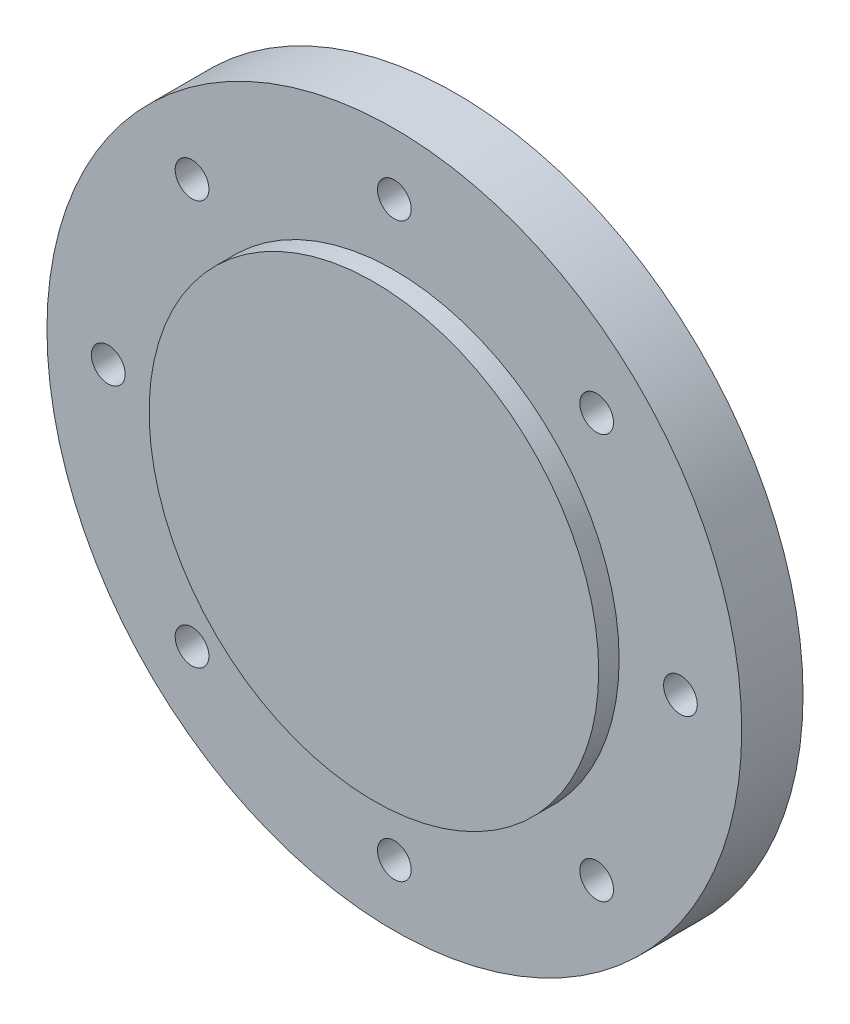
ISO-10303-21;
HEADER;
FILE_DESCRIPTION(('STEP AP214'),'2;1');
FILE_NAME('part.step','',(''),(''),'','','');
FILE_SCHEMA(('AUTOMOTIVE_DESIGN { 1 0 10303 214 1 1 1 1 }'));
ENDSEC;
DATA;
#1=APPLICATION_CONTEXT('core data for automotive mechanical design processes');
#2=APPLICATION_PROTOCOL_DEFINITION('international standard','automotive_design',2000,#1);
#3=PRODUCT_CONTEXT('',#1,'mechanical');
#4=PRODUCT('Part','Part','',(#3));
#5=PRODUCT_RELATED_PRODUCT_CATEGORY('part','',(#4));
#6=PRODUCT_DEFINITION_FORMATION('','',#4);
#7=PRODUCT_DEFINITION_CONTEXT('part definition',#1,'design');
#8=PRODUCT_DEFINITION('design','',#6,#7);
#9=PRODUCT_DEFINITION_SHAPE('','',#8);
#10=(LENGTH_UNIT() NAMED_UNIT(*) SI_UNIT(.MILLI.,.METRE.));
#11=(NAMED_UNIT(*) PLANE_ANGLE_UNIT() SI_UNIT($,.RADIAN.));
#12=(NAMED_UNIT(*) SI_UNIT($,.STERADIAN.) SOLID_ANGLE_UNIT());
#13=UNCERTAINTY_MEASURE_WITH_UNIT(LENGTH_MEASURE(1.E-05),#10,'distance_accuracy_value','');
#14=(GEOMETRIC_REPRESENTATION_CONTEXT(3) GLOBAL_UNCERTAINTY_ASSIGNED_CONTEXT((#13)) GLOBAL_UNIT_ASSIGNED_CONTEXT((#10,
#11,#12)) REPRESENTATION_CONTEXT('',''));
#15=CARTESIAN_POINT('',(0.,0.,0.));
#16=DIRECTION('',(0.,0.,1.));
#17=DIRECTION('',(1.,0.,0.));
#18=AXIS2_PLACEMENT_3D('',#15,#16,#17);
#19=CARTESIAN_POINT('',(0.,0.,6.));
#20=DIRECTION('',(0.,0.,-1.));
#21=DIRECTION('',(-1.,0.,0.));
#22=AXIS2_PLACEMENT_3D('',#19,#20,#21);
#23=CYLINDRICAL_SURFACE('',#22,34.);
#24=CARTESIAN_POINT('',(0.,0.,6.));
#25=DIRECTION('',(0.,0.,1.));
#26=DIRECTION('',(1.,0.,0.));
#27=AXIS2_PLACEMENT_3D('',#24,#25,#26);
#28=CIRCLE('',#27,34.);
#29=CARTESIAN_POINT('',(34.,0.,6.));
#30=VERTEX_POINT('',#29);
#31=EDGE_CURVE('E42',#30,#30,#28,.T.);
#32=ORIENTED_EDGE('',*,*,#31,.F.);
#33=EDGE_LOOP('',(#32));
#34=FACE_BOUND('',#33,.T.);
#35=CARTESIAN_POINT('',(0.,0.,0.));
#36=DIRECTION('',(0.,0.,1.));
#37=DIRECTION('',(1.,0.,0.));
#38=AXIS2_PLACEMENT_3D('',#35,#36,#37);
#39=CIRCLE('',#38,34.);
#40=CARTESIAN_POINT('',(34.,0.,0.));
#41=VERTEX_POINT('',#40);
#42=EDGE_CURVE('E37',#41,#41,#39,.T.);
#43=ORIENTED_EDGE('',*,*,#42,.T.);
#44=EDGE_LOOP('',(#43));
#45=FACE_BOUND('',#44,.T.);
#46=ADVANCED_FACE('F40',(#34,#45),#23,.T.);
#47=CARTESIAN_POINT('',(0.,0.,6.));
#48=DIRECTION('',(0.,0.,1.));
#49=DIRECTION('',(1.,0.,0.));
#50=AXIS2_PLACEMENT_3D('',#47,#48,#49);
#51=PLANE('',#50);
#52=CARTESIAN_POINT('',(0.,28.,6.));
#53=DIRECTION('',(0.,0.,1.));
#54=DIRECTION('',(0.,1.,0.));
#55=AXIS2_PLACEMENT_3D('',#52,#53,#54);
#56=CIRCLE('',#55,1.65);
#57=CARTESIAN_POINT('',(0.,29.65,6.));
#58=VERTEX_POINT('',#57);
#59=EDGE_CURVE('E85',#58,#58,#56,.T.);
#60=ORIENTED_EDGE('',*,*,#59,.F.);
#61=EDGE_LOOP('',(#60));
#62=FACE_BOUND('',#61,.T.);
#63=CARTESIAN_POINT('',(-19.7989898732233,19.7989898732233,6.));
#64=DIRECTION('',(0.,0.,1.));
#65=DIRECTION('',(-0.707106781186547,0.707106781186548,0.));
#66=AXIS2_PLACEMENT_3D('',#63,#64,#65);
#67=CIRCLE('',#66,1.65);
#68=CARTESIAN_POINT('',(-20.9657160621811,20.9657160621811,6.));
#69=VERTEX_POINT('',#68);
#70=EDGE_CURVE('E78',#69,#69,#67,.T.);
#71=ORIENTED_EDGE('',*,*,#70,.F.);
#72=EDGE_LOOP('',(#71));
#73=FACE_BOUND('',#72,.T.);
#74=CARTESIAN_POINT('',(-28.,0.,6.));
#75=DIRECTION('',(0.,0.,1.));
#76=DIRECTION('',(-1.,0.,0.));
#77=AXIS2_PLACEMENT_3D('',#74,#75,#76);
#78=CIRCLE('',#77,1.65);
#79=CARTESIAN_POINT('',(-29.65,0.,6.));
#80=VERTEX_POINT('',#79);
#81=EDGE_CURVE('E71',#80,#80,#78,.T.);
#82=ORIENTED_EDGE('',*,*,#81,.F.);
#83=EDGE_LOOP('',(#82));
#84=FACE_BOUND('',#83,.T.);
#85=CARTESIAN_POINT('',(-19.7989898732233,-19.7989898732233,6.));
#86=DIRECTION('',(0.,0.,1.));
#87=DIRECTION('',(-0.707106781186548,-0.707106781186547,0.));
#88=AXIS2_PLACEMENT_3D('',#85,#86,#87);
#89=CIRCLE('',#88,1.65);
#90=CARTESIAN_POINT('',(-20.9657160621811,-20.9657160621811,6.));
#91=VERTEX_POINT('',#90);
#92=EDGE_CURVE('E66',#91,#91,#89,.T.);
#93=ORIENTED_EDGE('',*,*,#92,.F.);
#94=EDGE_LOOP('',(#93));
#95=FACE_BOUND('',#94,.T.);
#96=CARTESIAN_POINT('',(0.,-28.,6.));
#97=DIRECTION('',(0.,0.,1.));
#98=DIRECTION('',(0.,-1.,0.));
#99=AXIS2_PLACEMENT_3D('',#96,#97,#98);
#100=CIRCLE('',#99,1.65);
#101=CARTESIAN_POINT('',(0.,-29.65,6.));
#102=VERTEX_POINT('',#101);
#103=EDGE_CURVE('E96',#102,#102,#100,.T.);
#104=ORIENTED_EDGE('',*,*,#103,.F.);
#105=EDGE_LOOP('',(#104));
#106=FACE_BOUND('',#105,.T.);
#107=CARTESIAN_POINT('',(19.7989898732233,-19.7989898732233,6.));
#108=DIRECTION('',(0.,0.,1.));
#109=DIRECTION('',(0.707106781186547,-0.707106781186548,0.));
#110=AXIS2_PLACEMENT_3D('',#107,#108,#109);
#111=CIRCLE('',#110,1.65);
#112=CARTESIAN_POINT('',(20.9657160621811,-20.9657160621811,6.));
#113=VERTEX_POINT('',#112);
#114=EDGE_CURVE('E89',#113,#113,#111,.T.);
#115=ORIENTED_EDGE('',*,*,#114,.F.);
#116=EDGE_LOOP('',(#115));
#117=FACE_BOUND('',#116,.T.);
#118=CARTESIAN_POINT('',(19.7989898732233,19.7989898732233,6.));
#119=DIRECTION('',(0.,0.,1.));
#120=DIRECTION('',(0.707106781186548,0.707106781186548,0.));
#121=AXIS2_PLACEMENT_3D('',#118,#119,#120);
#122=CIRCLE('',#121,1.65);
#123=CARTESIAN_POINT('',(20.9657160621811,20.9657160621811,6.));
#124=VERTEX_POINT('',#123);
#125=EDGE_CURVE('E58',#124,#124,#122,.T.);
#126=ORIENTED_EDGE('',*,*,#125,.F.);
#127=EDGE_LOOP('',(#126));
#128=FACE_BOUND('',#127,.T.);
#129=CARTESIAN_POINT('',(28.,0.,6.));
#130=DIRECTION('',(0.,0.,1.));
#131=DIRECTION('',(1.,0.,0.));
#132=AXIS2_PLACEMENT_3D('',#129,#130,#131);
#133=CIRCLE('',#132,1.65);
#134=CARTESIAN_POINT('',(29.65,0.,6.));
#135=VERTEX_POINT('',#134);
#136=EDGE_CURVE('E53',#135,#135,#133,.T.);
#137=ORIENTED_EDGE('',*,*,#136,.F.);
#138=EDGE_LOOP('',(#137));
#139=FACE_BOUND('',#138,.T.);
#140=CARTESIAN_POINT('',(0.,0.,6.));
#141=DIRECTION('',(0.,0.,1.));
#142=DIRECTION('',(1.,0.,0.));
#143=AXIS2_PLACEMENT_3D('',#140,#141,#142);
#144=CIRCLE('',#143,22.);
#145=CARTESIAN_POINT('',(22.,0.,6.));
#146=VERTEX_POINT('',#145);
#147=EDGE_CURVE('E10',#146,#146,#144,.T.);
#148=ORIENTED_EDGE('',*,*,#147,.F.);
#149=EDGE_LOOP('',(#148));
#150=FACE_BOUND('',#149,.T.);
#151=ORIENTED_EDGE('',*,*,#31,.T.);
#152=EDGE_LOOP('',(#151));
#153=FACE_BOUND('',#152,.T.);
#154=ADVANCED_FACE('F114',(#62,#73,#84,#95,#106,#117,#128,#139,#150,#153),#51,.T.);
#155=CARTESIAN_POINT('',(0.,0.,0.));
#156=DIRECTION('',(0.,0.,1.));
#157=DIRECTION('',(1.,0.,0.));
#158=AXIS2_PLACEMENT_3D('',#155,#156,#157);
#159=PLANE('',#158);
#160=CARTESIAN_POINT('',(0.,28.,0.));
#161=DIRECTION('',(0.,0.,1.));
#162=DIRECTION('',(0.,1.,0.));
#163=AXIS2_PLACEMENT_3D('',#160,#161,#162);
#164=CIRCLE('',#163,1.65);
#165=CARTESIAN_POINT('',(0.,29.65,0.));
#166=VERTEX_POINT('',#165);
#167=EDGE_CURVE('E65',#166,#166,#164,.T.);
#168=ORIENTED_EDGE('',*,*,#167,.T.);
#169=EDGE_LOOP('',(#168));
#170=FACE_BOUND('',#169,.T.);
#171=CARTESIAN_POINT('',(-19.7989898732233,19.7989898732233,0.));
#172=DIRECTION('',(0.,0.,1.));
#173=DIRECTION('',(-0.707106781186547,0.707106781186548,0.));
#174=AXIS2_PLACEMENT_3D('',#171,#172,#173);
#175=CIRCLE('',#174,1.65);
#176=CARTESIAN_POINT('',(-20.9657160621811,20.9657160621811,0.));
#177=VERTEX_POINT('',#176);
#178=EDGE_CURVE('E82',#177,#177,#175,.T.);
#179=ORIENTED_EDGE('',*,*,#178,.T.);
#180=EDGE_LOOP('',(#179));
#181=FACE_BOUND('',#180,.T.);
#182=CARTESIAN_POINT('',(-28.,0.,0.));
#183=DIRECTION('',(0.,0.,1.));
#184=DIRECTION('',(-1.,0.,0.));
#185=AXIS2_PLACEMENT_3D('',#182,#183,#184);
#186=CIRCLE('',#185,1.65);
#187=CARTESIAN_POINT('',(-29.65,0.,0.));
#188=VERTEX_POINT('',#187);
#189=EDGE_CURVE('E79',#188,#188,#186,.T.);
#190=ORIENTED_EDGE('',*,*,#189,.T.);
#191=EDGE_LOOP('',(#190));
#192=FACE_BOUND('',#191,.T.);
#193=CARTESIAN_POINT('',(-19.7989898732233,-19.7989898732233,0.));
#194=DIRECTION('',(0.,0.,1.));
#195=DIRECTION('',(-0.707106781186548,-0.707106781186547,0.));
#196=AXIS2_PLACEMENT_3D('',#193,#194,#195);
#197=CIRCLE('',#196,1.65);
#198=CARTESIAN_POINT('',(-20.9657160621811,-20.9657160621811,0.));
#199=VERTEX_POINT('',#198);
#200=EDGE_CURVE('E68',#199,#199,#197,.T.);
#201=ORIENTED_EDGE('',*,*,#200,.T.);
#202=EDGE_LOOP('',(#201));
#203=FACE_BOUND('',#202,.T.);
#204=CARTESIAN_POINT('',(0.,-28.,0.));
#205=DIRECTION('',(0.,0.,1.));
#206=DIRECTION('',(0.,-1.,0.));
#207=AXIS2_PLACEMENT_3D('',#204,#205,#206);
#208=CIRCLE('',#207,1.65);
#209=CARTESIAN_POINT('',(0.,-29.65,0.));
#210=VERTEX_POINT('',#209);
#211=EDGE_CURVE('E70',#210,#210,#208,.T.);
#212=ORIENTED_EDGE('',*,*,#211,.T.);
#213=EDGE_LOOP('',(#212));
#214=FACE_BOUND('',#213,.T.);
#215=CARTESIAN_POINT('',(19.7989898732233,-19.7989898732233,0.));
#216=DIRECTION('',(0.,0.,1.));
#217=DIRECTION('',(0.707106781186547,-0.707106781186548,0.));
#218=AXIS2_PLACEMENT_3D('',#215,#216,#217);
#219=CIRCLE('',#218,1.65);
#220=CARTESIAN_POINT('',(20.9657160621811,-20.9657160621811,0.));
#221=VERTEX_POINT('',#220);
#222=EDGE_CURVE('E91',#221,#221,#219,.T.);
#223=ORIENTED_EDGE('',*,*,#222,.T.);
#224=EDGE_LOOP('',(#223));
#225=FACE_BOUND('',#224,.T.);
#226=CARTESIAN_POINT('',(19.7989898732233,19.7989898732233,0.));
#227=DIRECTION('',(0.,0.,1.));
#228=DIRECTION('',(0.707106781186548,0.707106781186548,0.));
#229=AXIS2_PLACEMENT_3D('',#226,#227,#228);
#230=CIRCLE('',#229,1.65);
#231=CARTESIAN_POINT('',(20.9657160621811,20.9657160621811,0.));
#232=VERTEX_POINT('',#231);
#233=EDGE_CURVE('E60',#232,#232,#230,.T.);
#234=ORIENTED_EDGE('',*,*,#233,.T.);
#235=EDGE_LOOP('',(#234));
#236=FACE_BOUND('',#235,.T.);
#237=CARTESIAN_POINT('',(28.,0.,0.));
#238=DIRECTION('',(0.,0.,1.));
#239=DIRECTION('',(1.,0.,0.));
#240=AXIS2_PLACEMENT_3D('',#237,#238,#239);
#241=CIRCLE('',#240,1.65);
#242=CARTESIAN_POINT('',(29.65,0.,0.));
#243=VERTEX_POINT('',#242);
#244=EDGE_CURVE('E52',#243,#243,#241,.T.);
#245=ORIENTED_EDGE('',*,*,#244,.T.);
#246=EDGE_LOOP('',(#245));
#247=FACE_BOUND('',#246,.T.);
#248=ORIENTED_EDGE('',*,*,#42,.F.);
#249=EDGE_LOOP('',(#248));
#250=FACE_BOUND('',#249,.T.);
#251=ADVANCED_FACE('F105',(#170,#181,#192,#203,#214,#225,#236,#247,#250),#159,.F.);
#252=CARTESIAN_POINT('',(0.,0.,8.));
#253=DIRECTION('',(0.,0.,-1.));
#254=DIRECTION('',(-1.,0.,0.));
#255=AXIS2_PLACEMENT_3D('',#252,#253,#254);
#256=CYLINDRICAL_SURFACE('',#255,22.);
#257=CARTESIAN_POINT('',(0.,0.,8.));
#258=DIRECTION('',(0.,0.,1.));
#259=DIRECTION('',(1.,0.,0.));
#260=AXIS2_PLACEMENT_3D('',#257,#258,#259);
#261=CIRCLE('',#260,22.);
#262=CARTESIAN_POINT('',(22.,0.,8.));
#263=VERTEX_POINT('',#262);
#264=EDGE_CURVE('E49',#263,#263,#261,.T.);
#265=ORIENTED_EDGE('',*,*,#264,.F.);
#266=EDGE_LOOP('',(#265));
#267=FACE_BOUND('',#266,.T.);
#268=ORIENTED_EDGE('',*,*,#147,.T.);
#269=EDGE_LOOP('',(#268));
#270=FACE_BOUND('',#269,.T.);
#271=ADVANCED_FACE('F135',(#267,#270),#256,.T.);
#272=CARTESIAN_POINT('',(0.,0.,8.));
#273=DIRECTION('',(0.,0.,1.));
#274=DIRECTION('',(1.,0.,0.));
#275=AXIS2_PLACEMENT_3D('',#272,#273,#274);
#276=PLANE('',#275);
#277=ORIENTED_EDGE('',*,*,#264,.T.);
#278=EDGE_LOOP('',(#277));
#279=FACE_BOUND('',#278,.T.);
#280=ADVANCED_FACE('F138',(#279),#276,.T.);
#281=CARTESIAN_POINT('',(28.,0.,0.));
#282=DIRECTION('',(0.,0.,1.));
#283=DIRECTION('',(1.,0.,0.));
#284=AXIS2_PLACEMENT_3D('',#281,#282,#283);
#285=CYLINDRICAL_SURFACE('',#284,1.65);
#286=ORIENTED_EDGE('',*,*,#244,.F.);
#287=EDGE_LOOP('',(#286));
#288=FACE_BOUND('',#287,.T.);
#289=ORIENTED_EDGE('',*,*,#136,.T.);
#290=EDGE_LOOP('',(#289));
#291=FACE_BOUND('',#290,.T.);
#292=ADVANCED_FACE('F148',(#288,#291),#285,.F.);
#293=CARTESIAN_POINT('',(19.7989898732233,19.7989898732233,0.));
#294=DIRECTION('',(0.,0.,1.));
#295=DIRECTION('',(1.,0.,0.));
#296=AXIS2_PLACEMENT_3D('',#293,#294,#295);
#297=CYLINDRICAL_SURFACE('',#296,1.65);
#298=ORIENTED_EDGE('',*,*,#233,.F.);
#299=EDGE_LOOP('',(#298));
#300=FACE_BOUND('',#299,.T.);
#301=ORIENTED_EDGE('',*,*,#125,.T.);
#302=EDGE_LOOP('',(#301));
#303=FACE_BOUND('',#302,.T.);
#304=ADVANCED_FACE('F147',(#300,#303),#297,.F.);
#305=CARTESIAN_POINT('',(19.7989898732233,-19.7989898732233,0.));
#306=DIRECTION('',(0.,0.,1.));
#307=DIRECTION('',(1.,0.,0.));
#308=AXIS2_PLACEMENT_3D('',#305,#306,#307);
#309=CYLINDRICAL_SURFACE('',#308,1.65);
#310=ORIENTED_EDGE('',*,*,#222,.F.);
#311=EDGE_LOOP('',(#310));
#312=FACE_BOUND('',#311,.T.);
#313=ORIENTED_EDGE('',*,*,#114,.T.);
#314=EDGE_LOOP('',(#313));
#315=FACE_BOUND('',#314,.T.);
#316=ADVANCED_FACE('F108',(#312,#315),#309,.F.);
#317=CARTESIAN_POINT('',(0.,-28.,0.));
#318=DIRECTION('',(0.,0.,1.));
#319=DIRECTION('',(1.,0.,0.));
#320=AXIS2_PLACEMENT_3D('',#317,#318,#319);
#321=CYLINDRICAL_SURFACE('',#320,1.65);
#322=ORIENTED_EDGE('',*,*,#211,.F.);
#323=EDGE_LOOP('',(#322));
#324=FACE_BOUND('',#323,.T.);
#325=ORIENTED_EDGE('',*,*,#103,.T.);
#326=EDGE_LOOP('',(#325));
#327=FACE_BOUND('',#326,.T.);
#328=ADVANCED_FACE('F104',(#324,#327),#321,.F.);
#329=CARTESIAN_POINT('',(-19.7989898732233,-19.7989898732233,0.));
#330=DIRECTION('',(0.,0.,1.));
#331=DIRECTION('',(1.,0.,0.));
#332=AXIS2_PLACEMENT_3D('',#329,#330,#331);
#333=CYLINDRICAL_SURFACE('',#332,1.65);
#334=ORIENTED_EDGE('',*,*,#200,.F.);
#335=EDGE_LOOP('',(#334));
#336=FACE_BOUND('',#335,.T.);
#337=ORIENTED_EDGE('',*,*,#92,.T.);
#338=EDGE_LOOP('',(#337));
#339=FACE_BOUND('',#338,.T.);
#340=ADVANCED_FACE('F107',(#336,#339),#333,.F.);
#341=CARTESIAN_POINT('',(-28.,0.,0.));
#342=DIRECTION('',(0.,0.,1.));
#343=DIRECTION('',(1.,0.,0.));
#344=AXIS2_PLACEMENT_3D('',#341,#342,#343);
#345=CYLINDRICAL_SURFACE('',#344,1.65);
#346=ORIENTED_EDGE('',*,*,#189,.F.);
#347=EDGE_LOOP('',(#346));
#348=FACE_BOUND('',#347,.T.);
#349=ORIENTED_EDGE('',*,*,#81,.T.);
#350=EDGE_LOOP('',(#349));
#351=FACE_BOUND('',#350,.T.);
#352=ADVANCED_FACE('F156',(#348,#351),#345,.F.);
#353=CARTESIAN_POINT('',(-19.7989898732233,19.7989898732233,0.));
#354=DIRECTION('',(0.,0.,1.));
#355=DIRECTION('',(1.,0.,0.));
#356=AXIS2_PLACEMENT_3D('',#353,#354,#355);
#357=CYLINDRICAL_SURFACE('',#356,1.65);
#358=ORIENTED_EDGE('',*,*,#178,.F.);
#359=EDGE_LOOP('',(#358));
#360=FACE_BOUND('',#359,.T.);
#361=ORIENTED_EDGE('',*,*,#70,.T.);
#362=EDGE_LOOP('',(#361));
#363=FACE_BOUND('',#362,.T.);
#364=ADVANCED_FACE('F159',(#360,#363),#357,.F.);
#365=CARTESIAN_POINT('',(0.,28.,0.));
#366=DIRECTION('',(0.,0.,1.));
#367=DIRECTION('',(1.,0.,0.));
#368=AXIS2_PLACEMENT_3D('',#365,#366,#367);
#369=CYLINDRICAL_SURFACE('',#368,1.65);
#370=ORIENTED_EDGE('',*,*,#167,.F.);
#371=EDGE_LOOP('',(#370));
#372=FACE_BOUND('',#371,.T.);
#373=ORIENTED_EDGE('',*,*,#59,.T.);
#374=EDGE_LOOP('',(#373));
#375=FACE_BOUND('',#374,.T.);
#376=ADVANCED_FACE('F163',(#372,#375),#369,.F.);
#377=CLOSED_SHELL('',(#46,#154,#251,#271,#280,#292,#304,#316,#328,#340,#352,#364,#376));
#378=MANIFOLD_SOLID_BREP('B2',#377);
#379=ADVANCED_BREP_SHAPE_REPRESENTATION('',(#18,#378),#14);
#380=SHAPE_DEFINITION_REPRESENTATION(#9,#379);
ENDSEC;
END-ISO-10303-21;
